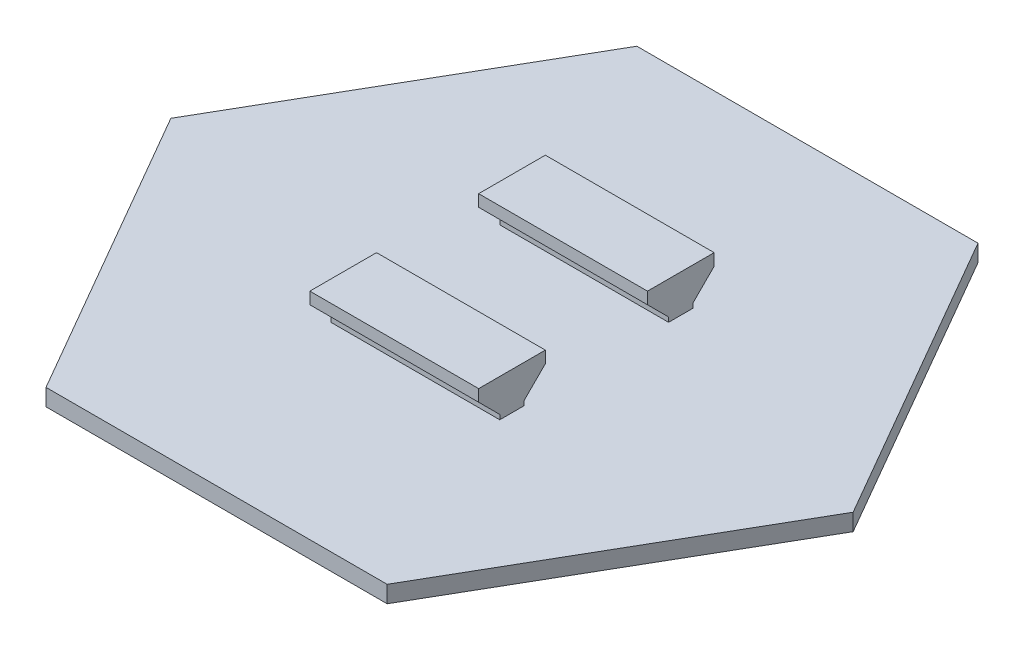
ISO-10303-21;
HEADER;
FILE_DESCRIPTION(('STEP AP214'),'2;1');
FILE_NAME('part.step','',(''),(''),'','','');
FILE_SCHEMA(('AUTOMOTIVE_DESIGN { 1 0 10303 214 1 1 1 1 }'));
ENDSEC;
DATA;
#1=APPLICATION_CONTEXT('core data for automotive mechanical design processes');
#2=APPLICATION_PROTOCOL_DEFINITION('international standard','automotive_design',2000,#1);
#3=PRODUCT_CONTEXT('',#1,'mechanical');
#4=PRODUCT('Part','Part','',(#3));
#5=PRODUCT_RELATED_PRODUCT_CATEGORY('part','',(#4));
#6=PRODUCT_DEFINITION_FORMATION('','',#4);
#7=PRODUCT_DEFINITION_CONTEXT('part definition',#1,'design');
#8=PRODUCT_DEFINITION('design','',#6,#7);
#9=PRODUCT_DEFINITION_SHAPE('','',#8);
#10=(LENGTH_UNIT() NAMED_UNIT(*) SI_UNIT(.MILLI.,.METRE.));
#11=(NAMED_UNIT(*) PLANE_ANGLE_UNIT() SI_UNIT($,.RADIAN.));
#12=(NAMED_UNIT(*) SI_UNIT($,.STERADIAN.) SOLID_ANGLE_UNIT());
#13=UNCERTAINTY_MEASURE_WITH_UNIT(LENGTH_MEASURE(1.E-05),#10,'distance_accuracy_value','');
#14=(GEOMETRIC_REPRESENTATION_CONTEXT(3) GLOBAL_UNCERTAINTY_ASSIGNED_CONTEXT((#13)) GLOBAL_UNIT_ASSIGNED_CONTEXT((#10,
#11,#12)) REPRESENTATION_CONTEXT('',''));
#15=CARTESIAN_POINT('',(0.,0.,0.));
#16=DIRECTION('',(0.,0.,1.));
#17=DIRECTION('',(1.,0.,0.));
#18=AXIS2_PLACEMENT_3D('',#15,#16,#17);
#19=CARTESIAN_POINT('',(0.,1.,0.));
#20=DIRECTION('',(0.,1.,0.));
#21=DIRECTION('',(0.,0.,1.));
#22=AXIS2_PLACEMENT_3D('',#19,#20,#21);
#23=PLANE('',#22);
#24=DIRECTION('',(0.5,0.,-0.866025403784439));
#25=VECTOR('',#24,1.);
#26=CARTESIAN_POINT('',(20.2072594216369,1.,35.));
#27=LINE('',#26,#25);
#28=CARTESIAN_POINT('',(20.2072594216369,1.,35.));
#29=VERTEX_POINT('',#28);
#30=CARTESIAN_POINT('',(40.4145188432738,1.,0.));
#31=VERTEX_POINT('',#30);
#32=EDGE_CURVE('E374',#29,#31,#27,.T.);
#33=ORIENTED_EDGE('',*,*,#32,.T.);
#34=DIRECTION('',(-0.5,0.,-0.866025403784439));
#35=VECTOR('',#34,1.);
#36=CARTESIAN_POINT('',(40.4145188432738,1.,0.));
#37=LINE('',#36,#35);
#38=CARTESIAN_POINT('',(20.2072594216369,1.,-35.));
#39=VERTEX_POINT('',#38);
#40=EDGE_CURVE('E378',#31,#39,#37,.T.);
#41=ORIENTED_EDGE('',*,*,#40,.T.);
#42=DIRECTION('',(-1.,0.,0.));
#43=VECTOR('',#42,1.);
#44=CARTESIAN_POINT('',(20.2072594216369,1.,-35.));
#45=LINE('',#44,#43);
#46=CARTESIAN_POINT('',(-20.2072594216369,1.,-35.));
#47=VERTEX_POINT('',#46);
#48=EDGE_CURVE('E382',#39,#47,#45,.T.);
#49=ORIENTED_EDGE('',*,*,#48,.T.);
#50=DIRECTION('',(-0.5,0.,0.866025403784439));
#51=VECTOR('',#50,1.);
#52=CARTESIAN_POINT('',(-20.2072594216369,1.,-35.));
#53=LINE('',#52,#51);
#54=CARTESIAN_POINT('',(-40.4145188432738,1.,0.));
#55=VERTEX_POINT('',#54);
#56=EDGE_CURVE('E385',#47,#55,#53,.T.);
#57=ORIENTED_EDGE('',*,*,#56,.T.);
#58=DIRECTION('',(0.5,0.,0.866025403784439));
#59=VECTOR('',#58,1.);
#60=CARTESIAN_POINT('',(-40.4145188432738,1.,0.));
#61=LINE('',#60,#59);
#62=CARTESIAN_POINT('',(-20.2072594216369,1.,35.));
#63=VERTEX_POINT('',#62);
#64=EDGE_CURVE('E388',#55,#63,#61,.T.);
#65=ORIENTED_EDGE('',*,*,#64,.T.);
#66=DIRECTION('',(1.,0.,0.));
#67=VECTOR('',#66,1.);
#68=CARTESIAN_POINT('',(-20.2072594216369,1.,35.));
#69=LINE('',#68,#67);
#70=EDGE_CURVE('E391',#63,#29,#69,.T.);
#71=ORIENTED_EDGE('',*,*,#70,.T.);
#72=EDGE_LOOP('',(#33,#41,#49,#57,#65,#71));
#73=FACE_BOUND('',#72,.T.);
#74=DIRECTION('',(1.,0.,0.));
#75=VECTOR('',#74,1.);
#76=CARTESIAN_POINT('',(-10.,1.,11.45));
#77=LINE('',#76,#75);
#78=CARTESIAN_POINT('',(-10.,1.,11.45));
#79=VERTEX_POINT('',#78);
#80=CARTESIAN_POINT('',(10.,1.,11.45));
#81=VERTEX_POINT('',#80);
#82=EDGE_CURVE('E355',#79,#81,#77,.T.);
#83=ORIENTED_EDGE('',*,*,#82,.F.);
#84=DIRECTION('',(0.,0.,-1.));
#85=VECTOR('',#84,1.);
#86=CARTESIAN_POINT('',(-10.,1.,0.));
#87=LINE('',#86,#85);
#88=CARTESIAN_POINT('',(-10.,1.,8.55));
#89=VERTEX_POINT('',#88);
#90=EDGE_CURVE('E307',#79,#89,#87,.T.);
#91=ORIENTED_EDGE('',*,*,#90,.T.);
#92=DIRECTION('',(1.,0.,0.));
#93=VECTOR('',#92,1.);
#94=CARTESIAN_POINT('',(-10.,1.,8.55));
#95=LINE('',#94,#93);
#96=CARTESIAN_POINT('',(10.,1.,8.55));
#97=VERTEX_POINT('',#96);
#98=EDGE_CURVE('E352',#89,#97,#95,.T.);
#99=ORIENTED_EDGE('',*,*,#98,.T.);
#100=DIRECTION('',(0.,0.,-1.));
#101=VECTOR('',#100,1.);
#102=CARTESIAN_POINT('',(10.,1.,0.));
#103=LINE('',#102,#101);
#104=EDGE_CURVE('E333',#81,#97,#103,.T.);
#105=ORIENTED_EDGE('',*,*,#104,.F.);
#106=EDGE_LOOP('',(#83,#91,#99,#105));
#107=FACE_BOUND('',#106,.T.);
#108=DIRECTION('',(1.,0.,0.));
#109=VECTOR('',#108,1.);
#110=CARTESIAN_POINT('',(-10.,1.,-8.55));
#111=LINE('',#110,#109);
#112=CARTESIAN_POINT('',(-10.,1.,-8.55));
#113=VERTEX_POINT('',#112);
#114=CARTESIAN_POINT('',(10.,1.,-8.55));
#115=VERTEX_POINT('',#114);
#116=EDGE_CURVE('E68',#113,#115,#111,.T.);
#117=ORIENTED_EDGE('',*,*,#116,.F.);
#118=DIRECTION('',(0.,0.,1.));
#119=VECTOR('',#118,1.);
#120=CARTESIAN_POINT('',(-10.,1.,0.));
#121=LINE('',#120,#119);
#122=CARTESIAN_POINT('',(-10.,1.,-11.45));
#123=VERTEX_POINT('',#122);
#124=EDGE_CURVE('E63',#123,#113,#121,.T.);
#125=ORIENTED_EDGE('',*,*,#124,.F.);
#126=DIRECTION('',(1.,0.,0.));
#127=VECTOR('',#126,1.);
#128=CARTESIAN_POINT('',(-10.,1.,-11.45));
#129=LINE('',#128,#127);
#130=CARTESIAN_POINT('',(10.,1.,-11.45));
#131=VERTEX_POINT('',#130);
#132=EDGE_CURVE('E283',#123,#131,#129,.T.);
#133=ORIENTED_EDGE('',*,*,#132,.T.);
#134=DIRECTION('',(0.,0.,1.));
#135=VECTOR('',#134,1.);
#136=CARTESIAN_POINT('',(10.,1.,0.));
#137=LINE('',#136,#135);
#138=EDGE_CURVE('E257',#131,#115,#137,.T.);
#139=ORIENTED_EDGE('',*,*,#138,.T.);
#140=EDGE_LOOP('',(#117,#125,#133,#139));
#141=FACE_BOUND('',#140,.T.);
#142=ADVANCED_FACE('F47',(#73,#107,#141),#23,.T.);
#143=CARTESIAN_POINT('',(20.2072594216369,1.,35.));
#144=DIRECTION('',(-0.866025403784439,0.,-0.5));
#145=DIRECTION('',(-0.5,0.,0.866025403784439));
#146=AXIS2_PLACEMENT_3D('',#143,#144,#145);
#147=PLANE('',#146);
#148=DIRECTION('',(0.5,0.,-0.866025403784439));
#149=VECTOR('',#148,1.);
#150=CARTESIAN_POINT('',(20.2072594216369,-1.,35.));
#151=LINE('',#150,#149);
#152=CARTESIAN_POINT('',(20.2072594216369,-1.,35.));
#153=VERTEX_POINT('',#152);
#154=CARTESIAN_POINT('',(40.4145188432738,-1.,0.));
#155=VERTEX_POINT('',#154);
#156=EDGE_CURVE('E348',#153,#155,#151,.T.);
#157=ORIENTED_EDGE('',*,*,#156,.T.);
#158=DIRECTION('',(0.,-1.,0.));
#159=VECTOR('',#158,1.);
#160=CARTESIAN_POINT('',(40.4145188432738,1.,0.));
#161=LINE('',#160,#159);
#162=EDGE_CURVE('E11',#31,#155,#161,.T.);
#163=ORIENTED_EDGE('',*,*,#162,.F.);
#164=ORIENTED_EDGE('',*,*,#32,.F.);
#165=DIRECTION('',(0.,-1.,0.));
#166=VECTOR('',#165,1.);
#167=CARTESIAN_POINT('',(20.2072594216369,1.,35.));
#168=LINE('',#167,#166);
#169=EDGE_CURVE('E394',#29,#153,#168,.T.);
#170=ORIENTED_EDGE('',*,*,#169,.T.);
#171=EDGE_LOOP('',(#157,#163,#164,#170));
#172=FACE_BOUND('',#171,.T.);
#173=ADVANCED_FACE('F49',(#172),#147,.F.);
#174=CARTESIAN_POINT('',(40.4145188432738,1.,0.));
#175=DIRECTION('',(-0.866025403784439,0.,0.5));
#176=DIRECTION('',(0.5,0.,0.866025403784439));
#177=AXIS2_PLACEMENT_3D('',#174,#175,#176);
#178=PLANE('',#177);
#179=DIRECTION('',(-0.5,0.,-0.866025403784439));
#180=VECTOR('',#179,1.);
#181=CARTESIAN_POINT('',(40.4145188432738,-1.,0.));
#182=LINE('',#181,#180);
#183=CARTESIAN_POINT('',(20.2072594216369,-1.,-35.));
#184=VERTEX_POINT('',#183);
#185=EDGE_CURVE('E398',#155,#184,#182,.T.);
#186=ORIENTED_EDGE('',*,*,#185,.T.);
#187=DIRECTION('',(0.,-1.,0.));
#188=VECTOR('',#187,1.);
#189=CARTESIAN_POINT('',(20.2072594216369,1.,-35.));
#190=LINE('',#189,#188);
#191=EDGE_CURVE('E56',#39,#184,#190,.T.);
#192=ORIENTED_EDGE('',*,*,#191,.F.);
#193=ORIENTED_EDGE('',*,*,#40,.F.);
#194=ORIENTED_EDGE('',*,*,#162,.T.);
#195=EDGE_LOOP('',(#186,#192,#193,#194));
#196=FACE_BOUND('',#195,.T.);
#197=ADVANCED_FACE('F455',(#196),#178,.F.);
#198=CARTESIAN_POINT('',(20.2072594216369,1.,-35.));
#199=DIRECTION('',(0.,0.,1.));
#200=DIRECTION('',(1.,0.,0.));
#201=AXIS2_PLACEMENT_3D('',#198,#199,#200);
#202=PLANE('',#201);
#203=DIRECTION('',(-1.,0.,0.));
#204=VECTOR('',#203,1.);
#205=CARTESIAN_POINT('',(20.2072594216369,-1.,-35.));
#206=LINE('',#205,#204);
#207=CARTESIAN_POINT('',(-20.2072594216369,-1.,-35.));
#208=VERTEX_POINT('',#207);
#209=EDGE_CURVE('E401',#184,#208,#206,.T.);
#210=ORIENTED_EDGE('',*,*,#209,.T.);
#211=DIRECTION('',(0.,-1.,0.));
#212=VECTOR('',#211,1.);
#213=CARTESIAN_POINT('',(-20.2072594216369,1.,-35.));
#214=LINE('',#213,#212);
#215=EDGE_CURVE('E423',#47,#208,#214,.T.);
#216=ORIENTED_EDGE('',*,*,#215,.F.);
#217=ORIENTED_EDGE('',*,*,#48,.F.);
#218=ORIENTED_EDGE('',*,*,#191,.T.);
#219=EDGE_LOOP('',(#210,#216,#217,#218));
#220=FACE_BOUND('',#219,.T.);
#221=ADVANCED_FACE('F432',(#220),#202,.F.);
#222=CARTESIAN_POINT('',(-20.2072594216369,1.,-35.));
#223=DIRECTION('',(0.866025403784439,0.,0.5));
#224=DIRECTION('',(0.5,0.,-0.866025403784439));
#225=AXIS2_PLACEMENT_3D('',#222,#223,#224);
#226=PLANE('',#225);
#227=DIRECTION('',(-0.5,0.,0.866025403784439));
#228=VECTOR('',#227,1.);
#229=CARTESIAN_POINT('',(-20.2072594216369,-1.,-35.));
#230=LINE('',#229,#228);
#231=CARTESIAN_POINT('',(-40.4145188432738,-1.,0.));
#232=VERTEX_POINT('',#231);
#233=EDGE_CURVE('E404',#208,#232,#230,.T.);
#234=ORIENTED_EDGE('',*,*,#233,.T.);
#235=DIRECTION('',(0.,-1.,0.));
#236=VECTOR('',#235,1.);
#237=CARTESIAN_POINT('',(-40.4145188432738,1.,0.));
#238=LINE('',#237,#236);
#239=EDGE_CURVE('E419',#55,#232,#238,.T.);
#240=ORIENTED_EDGE('',*,*,#239,.F.);
#241=ORIENTED_EDGE('',*,*,#56,.F.);
#242=ORIENTED_EDGE('',*,*,#215,.T.);
#243=EDGE_LOOP('',(#234,#240,#241,#242));
#244=FACE_BOUND('',#243,.T.);
#245=ADVANCED_FACE('F443',(#244),#226,.F.);
#246=CARTESIAN_POINT('',(-40.4145188432738,1.,0.));
#247=DIRECTION('',(0.866025403784439,0.,-0.5));
#248=DIRECTION('',(-0.5,0.,-0.866025403784439));
#249=AXIS2_PLACEMENT_3D('',#246,#247,#248);
#250=PLANE('',#249);
#251=DIRECTION('',(0.5,0.,0.866025403784439));
#252=VECTOR('',#251,1.);
#253=CARTESIAN_POINT('',(-40.4145188432738,-1.,0.));
#254=LINE('',#253,#252);
#255=CARTESIAN_POINT('',(-20.2072594216369,-1.,35.));
#256=VERTEX_POINT('',#255);
#257=EDGE_CURVE('E407',#232,#256,#254,.T.);
#258=ORIENTED_EDGE('',*,*,#257,.T.);
#259=DIRECTION('',(0.,-1.,0.));
#260=VECTOR('',#259,1.);
#261=CARTESIAN_POINT('',(-20.2072594216369,1.,35.));
#262=LINE('',#261,#260);
#263=EDGE_CURVE('E415',#63,#256,#262,.T.);
#264=ORIENTED_EDGE('',*,*,#263,.F.);
#265=ORIENTED_EDGE('',*,*,#64,.F.);
#266=ORIENTED_EDGE('',*,*,#239,.T.);
#267=EDGE_LOOP('',(#258,#264,#265,#266));
#268=FACE_BOUND('',#267,.T.);
#269=ADVANCED_FACE('F447',(#268),#250,.F.);
#270=CARTESIAN_POINT('',(-20.2072594216369,1.,35.));
#271=DIRECTION('',(0.,0.,-1.));
#272=DIRECTION('',(-1.,0.,0.));
#273=AXIS2_PLACEMENT_3D('',#270,#271,#272);
#274=PLANE('',#273);
#275=DIRECTION('',(1.,0.,0.));
#276=VECTOR('',#275,1.);
#277=CARTESIAN_POINT('',(-20.2072594216369,-1.,35.));
#278=LINE('',#277,#276);
#279=EDGE_CURVE('E379',#256,#153,#278,.T.);
#280=ORIENTED_EDGE('',*,*,#279,.T.);
#281=ORIENTED_EDGE('',*,*,#169,.F.);
#282=ORIENTED_EDGE('',*,*,#70,.F.);
#283=ORIENTED_EDGE('',*,*,#263,.T.);
#284=EDGE_LOOP('',(#280,#281,#282,#283));
#285=FACE_BOUND('',#284,.T.);
#286=ADVANCED_FACE('F458',(#285),#274,.F.);
#287=CARTESIAN_POINT('',(0.,-1.,0.));
#288=DIRECTION('',(0.,1.,0.));
#289=DIRECTION('',(0.,0.,1.));
#290=AXIS2_PLACEMENT_3D('',#287,#288,#289);
#291=PLANE('',#290);
#292=ORIENTED_EDGE('',*,*,#156,.F.);
#293=ORIENTED_EDGE('',*,*,#279,.F.);
#294=ORIENTED_EDGE('',*,*,#257,.F.);
#295=ORIENTED_EDGE('',*,*,#233,.F.);
#296=ORIENTED_EDGE('',*,*,#209,.F.);
#297=ORIENTED_EDGE('',*,*,#185,.F.);
#298=EDGE_LOOP('',(#292,#293,#294,#295,#296,#297));
#299=FACE_BOUND('',#298,.T.);
#300=ADVANCED_FACE('F438',(#299),#291,.F.);
#301=CARTESIAN_POINT('',(-10.,0.,6.05000000000001));
#302=DIRECTION('',(0.,0.,1.));
#303=DIRECTION('',(0.,-1.,0.));
#304=AXIS2_PLACEMENT_3D('',#301,#302,#303);
#305=PLANE('',#304);
#306=DIRECTION('',(0.,-1.,0.));
#307=VECTOR('',#306,1.);
#308=CARTESIAN_POINT('',(10.,0.,6.05000000000001));
#309=LINE('',#308,#307);
#310=CARTESIAN_POINT('',(10.,5.45,6.05));
#311=VERTEX_POINT('',#310);
#312=CARTESIAN_POINT('',(10.,4.05,6.05));
#313=VERTEX_POINT('',#312);
#314=EDGE_CURVE('E273',#311,#313,#309,.T.);
#315=ORIENTED_EDGE('',*,*,#314,.T.);
#316=DIRECTION('',(1.,0.,0.));
#317=VECTOR('',#316,1.);
#318=CARTESIAN_POINT('',(-10.,4.05,6.05));
#319=LINE('',#318,#317);
#320=CARTESIAN_POINT('',(-10.,4.05,6.05));
#321=VERTEX_POINT('',#320);
#322=EDGE_CURVE('E344',#321,#313,#319,.T.);
#323=ORIENTED_EDGE('',*,*,#322,.F.);
#324=DIRECTION('',(0.,-1.,0.));
#325=VECTOR('',#324,1.);
#326=CARTESIAN_POINT('',(-10.,0.,6.05000000000001));
#327=LINE('',#326,#325);
#328=CARTESIAN_POINT('',(-10.,5.45,6.05));
#329=VERTEX_POINT('',#328);
#330=EDGE_CURVE('E290',#329,#321,#327,.T.);
#331=ORIENTED_EDGE('',*,*,#330,.F.);
#332=DIRECTION('',(1.,0.,0.));
#333=VECTOR('',#332,1.);
#334=CARTESIAN_POINT('',(-10.,5.45,6.05));
#335=LINE('',#334,#333);
#336=EDGE_CURVE('E317',#329,#311,#335,.T.);
#337=ORIENTED_EDGE('',*,*,#336,.T.);
#338=EDGE_LOOP('',(#315,#323,#331,#337));
#339=FACE_BOUND('',#338,.T.);
#340=ADVANCED_FACE('F465',(#339),#305,.F.);
#341=CARTESIAN_POINT('',(-10.,5.05,5.05));
#342=DIRECTION('',(0.,0.707106781186548,0.707106781186547));
#343=DIRECTION('',(0.,-0.707106781186547,0.707106781186548));
#344=AXIS2_PLACEMENT_3D('',#341,#342,#343);
#345=PLANE('',#344);
#346=DIRECTION('',(0.,-0.707106781186547,0.707106781186548));
#347=VECTOR('',#346,1.);
#348=CARTESIAN_POINT('',(10.,5.05,5.05));
#349=LINE('',#348,#347);
#350=CARTESIAN_POINT('',(10.,1.55,8.55));
#351=VERTEX_POINT('',#350);
#352=EDGE_CURVE('E295',#313,#351,#349,.T.);
#353=ORIENTED_EDGE('',*,*,#352,.T.);
#354=DIRECTION('',(1.,0.,0.));
#355=VECTOR('',#354,1.);
#356=CARTESIAN_POINT('',(-10.,1.55,8.55));
#357=LINE('',#356,#355);
#358=CARTESIAN_POINT('',(-10.,1.55,8.55));
#359=VERTEX_POINT('',#358);
#360=EDGE_CURVE('E349',#359,#351,#357,.T.);
#361=ORIENTED_EDGE('',*,*,#360,.F.);
#362=DIRECTION('',(0.,-0.707106781186547,0.707106781186548));
#363=VECTOR('',#362,1.);
#364=CARTESIAN_POINT('',(-10.,5.05,5.05));
#365=LINE('',#364,#363);
#366=EDGE_CURVE('E314',#321,#359,#365,.T.);
#367=ORIENTED_EDGE('',*,*,#366,.F.);
#368=ORIENTED_EDGE('',*,*,#322,.T.);
#369=EDGE_LOOP('',(#353,#361,#367,#368));
#370=FACE_BOUND('',#369,.T.);
#371=ADVANCED_FACE('F476',(#370),#345,.F.);
#372=CARTESIAN_POINT('',(-10.,0.,8.55));
#373=DIRECTION('',(0.,0.,-1.));
#374=DIRECTION('',(-1.,0.,0.));
#375=AXIS2_PLACEMENT_3D('',#372,#373,#374);
#376=PLANE('',#375);
#377=DIRECTION('',(0.,1.,0.));
#378=VECTOR('',#377,1.);
#379=CARTESIAN_POINT('',(10.,0.,8.55));
#380=LINE('',#379,#378);
#381=EDGE_CURVE('E337',#97,#351,#380,.T.);
#382=ORIENTED_EDGE('',*,*,#381,.F.);
#383=ORIENTED_EDGE('',*,*,#98,.F.);
#384=DIRECTION('',(0.,1.,0.));
#385=VECTOR('',#384,1.);
#386=CARTESIAN_POINT('',(-10.,0.,8.55));
#387=LINE('',#386,#385);
#388=EDGE_CURVE('E310',#89,#359,#387,.T.);
#389=ORIENTED_EDGE('',*,*,#388,.T.);
#390=ORIENTED_EDGE('',*,*,#360,.T.);
#391=EDGE_LOOP('',(#382,#383,#389,#390));
#392=FACE_BOUND('',#391,.T.);
#393=ADVANCED_FACE('F494',(#392),#376,.T.);
#394=CARTESIAN_POINT('',(-10.,0.,11.45));
#395=DIRECTION('',(0.,0.,-1.));
#396=DIRECTION('',(-1.,0.,0.));
#397=AXIS2_PLACEMENT_3D('',#394,#395,#396);
#398=PLANE('',#397);
#399=DIRECTION('',(0.,1.,0.));
#400=VECTOR('',#399,1.);
#401=CARTESIAN_POINT('',(10.,0.,11.45));
#402=LINE('',#401,#400);
#403=CARTESIAN_POINT('',(10.,1.55,11.45));
#404=VERTEX_POINT('',#403);
#405=EDGE_CURVE('E330',#81,#404,#402,.T.);
#406=ORIENTED_EDGE('',*,*,#405,.T.);
#407=DIRECTION('',(1.,0.,0.));
#408=VECTOR('',#407,1.);
#409=CARTESIAN_POINT('',(-10.,1.55,11.45));
#410=LINE('',#409,#408);
#411=CARTESIAN_POINT('',(-10.,1.55,11.45));
#412=VERTEX_POINT('',#411);
#413=EDGE_CURVE('E359',#412,#404,#410,.T.);
#414=ORIENTED_EDGE('',*,*,#413,.F.);
#415=DIRECTION('',(0.,1.,0.));
#416=VECTOR('',#415,1.);
#417=CARTESIAN_POINT('',(-10.,0.,11.45));
#418=LINE('',#417,#416);
#419=EDGE_CURVE('E304',#79,#412,#418,.T.);
#420=ORIENTED_EDGE('',*,*,#419,.F.);
#421=ORIENTED_EDGE('',*,*,#82,.T.);
#422=EDGE_LOOP('',(#406,#414,#420,#421));
#423=FACE_BOUND('',#422,.T.);
#424=ADVANCED_FACE('F490',(#423),#398,.F.);
#425=CARTESIAN_POINT('',(-10.,-4.95,4.95));
#426=DIRECTION('',(0.,0.707106781186548,-0.707106781186547));
#427=DIRECTION('',(0.,0.707106781186547,0.707106781186548));
#428=AXIS2_PLACEMENT_3D('',#425,#426,#427);
#429=PLANE('',#428);
#430=DIRECTION('',(0.,0.707106781186547,0.707106781186548));
#431=VECTOR('',#430,1.);
#432=CARTESIAN_POINT('',(10.,-4.95,4.95));
#433=LINE('',#432,#431);
#434=CARTESIAN_POINT('',(10.,4.05,13.95));
#435=VERTEX_POINT('',#434);
#436=EDGE_CURVE('E327',#404,#435,#433,.T.);
#437=ORIENTED_EDGE('',*,*,#436,.T.);
#438=DIRECTION('',(1.,0.,0.));
#439=VECTOR('',#438,1.);
#440=CARTESIAN_POINT('',(-10.,4.05,13.95));
#441=LINE('',#440,#439);
#442=CARTESIAN_POINT('',(-10.,4.05,13.95));
#443=VERTEX_POINT('',#442);
#444=EDGE_CURVE('E363',#443,#435,#441,.T.);
#445=ORIENTED_EDGE('',*,*,#444,.F.);
#446=DIRECTION('',(0.,0.707106781186547,0.707106781186548));
#447=VECTOR('',#446,1.);
#448=CARTESIAN_POINT('',(-10.,-4.95,4.95));
#449=LINE('',#448,#447);
#450=EDGE_CURVE('E301',#412,#443,#449,.T.);
#451=ORIENTED_EDGE('',*,*,#450,.F.);
#452=ORIENTED_EDGE('',*,*,#413,.T.);
#453=EDGE_LOOP('',(#437,#445,#451,#452));
#454=FACE_BOUND('',#453,.T.);
#455=ADVANCED_FACE('F486',(#454),#429,.F.);
#456=CARTESIAN_POINT('',(-10.,0.,13.95));
#457=DIRECTION('',(0.,0.,-1.));
#458=DIRECTION('',(0.,1.,0.));
#459=AXIS2_PLACEMENT_3D('',#456,#457,#458);
#460=PLANE('',#459);
#461=DIRECTION('',(0.,1.,0.));
#462=VECTOR('',#461,1.);
#463=CARTESIAN_POINT('',(10.,0.,13.95));
#464=LINE('',#463,#462);
#465=CARTESIAN_POINT('',(10.,5.45,13.95));
#466=VERTEX_POINT('',#465);
#467=EDGE_CURVE('E324',#435,#466,#464,.T.);
#468=ORIENTED_EDGE('',*,*,#467,.T.);
#469=DIRECTION('',(1.,0.,0.));
#470=VECTOR('',#469,1.);
#471=CARTESIAN_POINT('',(-10.,5.45,13.95));
#472=LINE('',#471,#470);
#473=CARTESIAN_POINT('',(-10.,5.45,13.95));
#474=VERTEX_POINT('',#473);
#475=EDGE_CURVE('E367',#474,#466,#472,.T.);
#476=ORIENTED_EDGE('',*,*,#475,.F.);
#477=DIRECTION('',(0.,1.,0.));
#478=VECTOR('',#477,1.);
#479=CARTESIAN_POINT('',(-10.,0.,13.95));
#480=LINE('',#479,#478);
#481=EDGE_CURVE('E298',#443,#474,#480,.T.);
#482=ORIENTED_EDGE('',*,*,#481,.F.);
#483=ORIENTED_EDGE('',*,*,#444,.T.);
#484=EDGE_LOOP('',(#468,#476,#482,#483));
#485=FACE_BOUND('',#484,.T.);
#486=ADVANCED_FACE('F482',(#485),#460,.F.);
#487=CARTESIAN_POINT('',(-10.,5.45,0.));
#488=DIRECTION('',(0.,-1.,0.));
#489=DIRECTION('',(0.,0.,-1.));
#490=AXIS2_PLACEMENT_3D('',#487,#488,#489);
#491=PLANE('',#490);
#492=DIRECTION('',(0.,0.,-1.));
#493=VECTOR('',#492,1.);
#494=CARTESIAN_POINT('',(10.,5.45,0.));
#495=LINE('',#494,#493);
#496=EDGE_CURVE('E321',#466,#311,#495,.T.);
#497=ORIENTED_EDGE('',*,*,#496,.T.);
#498=ORIENTED_EDGE('',*,*,#336,.F.);
#499=DIRECTION('',(0.,0.,-1.));
#500=VECTOR('',#499,1.);
#501=CARTESIAN_POINT('',(-10.,5.45,0.));
#502=LINE('',#501,#500);
#503=EDGE_CURVE('E294',#474,#329,#502,.T.);
#504=ORIENTED_EDGE('',*,*,#503,.F.);
#505=ORIENTED_EDGE('',*,*,#475,.T.);
#506=EDGE_LOOP('',(#497,#498,#504,#505));
#507=FACE_BOUND('',#506,.T.);
#508=ADVANCED_FACE('F478',(#507),#491,.F.);
#509=CARTESIAN_POINT('',(-10.,0.,0.));
#510=DIRECTION('',(1.,0.,0.));
#511=DIRECTION('',(0.,0.,-1.));
#512=AXIS2_PLACEMENT_3D('',#509,#510,#511);
#513=PLANE('',#512);
#514=ORIENTED_EDGE('',*,*,#330,.T.);
#515=ORIENTED_EDGE('',*,*,#366,.T.);
#516=ORIENTED_EDGE('',*,*,#388,.F.);
#517=ORIENTED_EDGE('',*,*,#90,.F.);
#518=ORIENTED_EDGE('',*,*,#419,.T.);
#519=ORIENTED_EDGE('',*,*,#450,.T.);
#520=ORIENTED_EDGE('',*,*,#481,.T.);
#521=ORIENTED_EDGE('',*,*,#503,.T.);
#522=EDGE_LOOP('',(#514,#515,#516,#517,#518,#519,#520,#521));
#523=FACE_BOUND('',#522,.T.);
#524=ADVANCED_FACE('F481',(#523),#513,.F.);
#525=CARTESIAN_POINT('',(10.,0.,0.));
#526=DIRECTION('',(1.,0.,0.));
#527=DIRECTION('',(0.,0.,-1.));
#528=AXIS2_PLACEMENT_3D('',#525,#526,#527);
#529=PLANE('',#528);
#530=ORIENTED_EDGE('',*,*,#314,.F.);
#531=ORIENTED_EDGE('',*,*,#496,.F.);
#532=ORIENTED_EDGE('',*,*,#467,.F.);
#533=ORIENTED_EDGE('',*,*,#436,.F.);
#534=ORIENTED_EDGE('',*,*,#405,.F.);
#535=ORIENTED_EDGE('',*,*,#104,.T.);
#536=ORIENTED_EDGE('',*,*,#381,.T.);
#537=ORIENTED_EDGE('',*,*,#352,.F.);
#538=EDGE_LOOP('',(#530,#531,#532,#533,#534,#535,#536,#537));
#539=FACE_BOUND('',#538,.T.);
#540=ADVANCED_FACE('F502',(#539),#529,.T.);
#541=CARTESIAN_POINT('',(-10.,0.,-6.05000000000001));
#542=DIRECTION('',(0.,0.,1.));
#543=DIRECTION('',(0.,-1.,0.));
#544=AXIS2_PLACEMENT_3D('',#541,#542,#543);
#545=PLANE('',#544);
#546=DIRECTION('',(0.,-1.,0.));
#547=VECTOR('',#546,1.);
#548=CARTESIAN_POINT('',(10.,0.,-6.05000000000001));
#549=LINE('',#548,#547);
#550=CARTESIAN_POINT('',(10.,5.45,-6.05));
#551=VERTEX_POINT('',#550);
#552=CARTESIAN_POINT('',(10.,4.05,-6.05));
#553=VERTEX_POINT('',#552);
#554=EDGE_CURVE('E248',#551,#553,#549,.T.);
#555=ORIENTED_EDGE('',*,*,#554,.F.);
#556=DIRECTION('',(1.,0.,0.));
#557=VECTOR('',#556,1.);
#558=CARTESIAN_POINT('',(-10.,5.45,-6.05));
#559=LINE('',#558,#557);
#560=CARTESIAN_POINT('',(-10.,5.45,-6.05));
#561=VERTEX_POINT('',#560);
#562=EDGE_CURVE('E221',#561,#551,#559,.T.);
#563=ORIENTED_EDGE('',*,*,#562,.F.);
#564=DIRECTION('',(0.,-1.,0.));
#565=VECTOR('',#564,1.);
#566=CARTESIAN_POINT('',(-10.,0.,-6.05000000000001));
#567=LINE('',#566,#565);
#568=CARTESIAN_POINT('',(-10.,4.05,-6.05));
#569=VERTEX_POINT('',#568);
#570=EDGE_CURVE('E213',#561,#569,#567,.T.);
#571=ORIENTED_EDGE('',*,*,#570,.T.);
#572=DIRECTION('',(1.,0.,0.));
#573=VECTOR('',#572,1.);
#574=CARTESIAN_POINT('',(-10.,4.05,-6.05));
#575=LINE('',#574,#573);
#576=EDGE_CURVE('E195',#569,#553,#575,.T.);
#577=ORIENTED_EDGE('',*,*,#576,.T.);
#578=EDGE_LOOP('',(#555,#563,#571,#577));
#579=FACE_BOUND('',#578,.T.);
#580=ADVANCED_FACE('F220',(#579),#545,.T.);
#581=CARTESIAN_POINT('',(-10.,5.45,0.));
#582=DIRECTION('',(0.,1.,0.));
#583=DIRECTION('',(0.,0.,1.));
#584=AXIS2_PLACEMENT_3D('',#581,#582,#583);
#585=PLANE('',#584);
#586=DIRECTION('',(0.,0.,1.));
#587=VECTOR('',#586,1.);
#588=CARTESIAN_POINT('',(10.,5.45,0.));
#589=LINE('',#588,#587);
#590=CARTESIAN_POINT('',(10.,5.45,-13.95));
#591=VERTEX_POINT('',#590);
#592=EDGE_CURVE('E223',#591,#551,#589,.T.);
#593=ORIENTED_EDGE('',*,*,#592,.F.);
#594=DIRECTION('',(1.,0.,0.));
#595=VECTOR('',#594,1.);
#596=CARTESIAN_POINT('',(-10.,5.45,-13.95));
#597=LINE('',#596,#595);
#598=CARTESIAN_POINT('',(-10.,5.45,-13.95));
#599=VERTEX_POINT('',#598);
#600=EDGE_CURVE('E274',#599,#591,#597,.T.);
#601=ORIENTED_EDGE('',*,*,#600,.F.);
#602=DIRECTION('',(0.,0.,1.));
#603=VECTOR('',#602,1.);
#604=CARTESIAN_POINT('',(-10.,5.45,0.));
#605=LINE('',#604,#603);
#606=EDGE_CURVE('E207',#599,#561,#605,.T.);
#607=ORIENTED_EDGE('',*,*,#606,.T.);
#608=ORIENTED_EDGE('',*,*,#562,.T.);
#609=EDGE_LOOP('',(#593,#601,#607,#608));
#610=FACE_BOUND('',#609,.T.);
#611=ADVANCED_FACE('F511',(#610),#585,.T.);
#612=CARTESIAN_POINT('',(-10.,0.,-13.95));
#613=DIRECTION('',(0.,0.,-1.));
#614=DIRECTION('',(0.,1.,0.));
#615=AXIS2_PLACEMENT_3D('',#612,#613,#614);
#616=PLANE('',#615);
#617=DIRECTION('',(0.,1.,0.));
#618=VECTOR('',#617,1.);
#619=CARTESIAN_POINT('',(10.,0.,-13.95));
#620=LINE('',#619,#618);
#621=CARTESIAN_POINT('',(10.,4.05,-13.95));
#622=VERTEX_POINT('',#621);
#623=EDGE_CURVE('E227',#622,#591,#620,.T.);
#624=ORIENTED_EDGE('',*,*,#623,.F.);
#625=DIRECTION('',(1.,0.,0.));
#626=VECTOR('',#625,1.);
#627=CARTESIAN_POINT('',(-10.,4.05,-13.95));
#628=LINE('',#627,#626);
#629=CARTESIAN_POINT('',(-10.,4.05,-13.95));
#630=VERTEX_POINT('',#629);
#631=EDGE_CURVE('E277',#630,#622,#628,.T.);
#632=ORIENTED_EDGE('',*,*,#631,.F.);
#633=DIRECTION('',(0.,1.,0.));
#634=VECTOR('',#633,1.);
#635=CARTESIAN_POINT('',(-10.,0.,-13.95));
#636=LINE('',#635,#634);
#637=EDGE_CURVE('E242',#630,#599,#636,.T.);
#638=ORIENTED_EDGE('',*,*,#637,.T.);
#639=ORIENTED_EDGE('',*,*,#600,.T.);
#640=EDGE_LOOP('',(#624,#632,#638,#639));
#641=FACE_BOUND('',#640,.T.);
#642=ADVANCED_FACE('F525',(#641),#616,.T.);
#643=CARTESIAN_POINT('',(-10.,-4.95,-4.95));
#644=DIRECTION('',(0.,-0.707106781186548,-0.707106781186547));
#645=DIRECTION('',(0.,0.707106781186547,-0.707106781186548));
#646=AXIS2_PLACEMENT_3D('',#643,#644,#645);
#647=PLANE('',#646);
#648=DIRECTION('',(0.,0.707106781186547,-0.707106781186548));
#649=VECTOR('',#648,1.);
#650=CARTESIAN_POINT('',(10.,-4.95,-4.95));
#651=LINE('',#650,#649);
#652=CARTESIAN_POINT('',(10.,1.55,-11.45));
#653=VERTEX_POINT('',#652);
#654=EDGE_CURVE('E264',#653,#622,#651,.T.);
#655=ORIENTED_EDGE('',*,*,#654,.F.);
#656=DIRECTION('',(1.,0.,0.));
#657=VECTOR('',#656,1.);
#658=CARTESIAN_POINT('',(-10.,1.55,-11.45));
#659=LINE('',#658,#657);
#660=CARTESIAN_POINT('',(-10.,1.55,-11.45));
#661=VERTEX_POINT('',#660);
#662=EDGE_CURVE('E280',#661,#653,#659,.T.);
#663=ORIENTED_EDGE('',*,*,#662,.F.);
#664=DIRECTION('',(0.,0.707106781186547,-0.707106781186548));
#665=VECTOR('',#664,1.);
#666=CARTESIAN_POINT('',(-10.,-4.95,-4.95));
#667=LINE('',#666,#665);
#668=EDGE_CURVE('E238',#661,#630,#667,.T.);
#669=ORIENTED_EDGE('',*,*,#668,.T.);
#670=ORIENTED_EDGE('',*,*,#631,.T.);
#671=EDGE_LOOP('',(#655,#663,#669,#670));
#672=FACE_BOUND('',#671,.T.);
#673=ADVANCED_FACE('F521',(#672),#647,.T.);
#674=CARTESIAN_POINT('',(-10.,0.,-11.45));
#675=DIRECTION('',(0.,0.,-1.));
#676=DIRECTION('',(-1.,0.,0.));
#677=AXIS2_PLACEMENT_3D('',#674,#675,#676);
#678=PLANE('',#677);
#679=DIRECTION('',(0.,1.,0.));
#680=VECTOR('',#679,1.);
#681=CARTESIAN_POINT('',(10.,0.,-11.45));
#682=LINE('',#681,#680);
#683=EDGE_CURVE('E260',#131,#653,#682,.T.);
#684=ORIENTED_EDGE('',*,*,#683,.F.);
#685=ORIENTED_EDGE('',*,*,#132,.F.);
#686=DIRECTION('',(0.,1.,0.));
#687=VECTOR('',#686,1.);
#688=CARTESIAN_POINT('',(-10.,0.,-11.45));
#689=LINE('',#688,#687);
#690=EDGE_CURVE('E234',#123,#661,#689,.T.);
#691=ORIENTED_EDGE('',*,*,#690,.T.);
#692=ORIENTED_EDGE('',*,*,#662,.T.);
#693=EDGE_LOOP('',(#684,#685,#691,#692));
#694=FACE_BOUND('',#693,.T.);
#695=ADVANCED_FACE('F517',(#694),#678,.T.);
#696=CARTESIAN_POINT('',(-10.,0.,-8.55));
#697=DIRECTION('',(0.,0.,-1.));
#698=DIRECTION('',(-1.,0.,0.));
#699=AXIS2_PLACEMENT_3D('',#696,#697,#698);
#700=PLANE('',#699);
#701=DIRECTION('',(0.,1.,0.));
#702=VECTOR('',#701,1.);
#703=CARTESIAN_POINT('',(10.,0.,-8.55));
#704=LINE('',#703,#702);
#705=CARTESIAN_POINT('',(10.,1.55,-8.55));
#706=VERTEX_POINT('',#705);
#707=EDGE_CURVE('E253',#115,#706,#704,.T.);
#708=ORIENTED_EDGE('',*,*,#707,.T.);
#709=DIRECTION('',(1.,0.,0.));
#710=VECTOR('',#709,1.);
#711=CARTESIAN_POINT('',(-10.,1.55,-8.55));
#712=LINE('',#711,#710);
#713=CARTESIAN_POINT('',(-10.,1.55,-8.55));
#714=VERTEX_POINT('',#713);
#715=EDGE_CURVE('E206',#714,#706,#712,.T.);
#716=ORIENTED_EDGE('',*,*,#715,.F.);
#717=DIRECTION('',(0.,1.,0.));
#718=VECTOR('',#717,1.);
#719=CARTESIAN_POINT('',(-10.,0.,-8.55));
#720=LINE('',#719,#718);
#721=EDGE_CURVE('E216',#113,#714,#720,.T.);
#722=ORIENTED_EDGE('',*,*,#721,.F.);
#723=ORIENTED_EDGE('',*,*,#116,.T.);
#724=EDGE_LOOP('',(#708,#716,#722,#723));
#725=FACE_BOUND('',#724,.T.);
#726=ADVANCED_FACE('F514',(#725),#700,.F.);
#727=CARTESIAN_POINT('',(-10.,5.05,-5.05));
#728=DIRECTION('',(0.,-0.707106781186548,0.707106781186547));
#729=DIRECTION('',(0.,-0.707106781186547,-0.707106781186548));
#730=AXIS2_PLACEMENT_3D('',#727,#728,#729);
#731=PLANE('',#730);
#732=DIRECTION('',(0.,-0.707106781186547,-0.707106781186548));
#733=VECTOR('',#732,1.);
#734=CARTESIAN_POINT('',(10.,5.05,-5.05));
#735=LINE('',#734,#733);
#736=EDGE_CURVE('E200',#553,#706,#735,.T.);
#737=ORIENTED_EDGE('',*,*,#736,.F.);
#738=ORIENTED_EDGE('',*,*,#576,.F.);
#739=DIRECTION('',(0.,-0.707106781186547,-0.707106781186548));
#740=VECTOR('',#739,1.);
#741=CARTESIAN_POINT('',(-10.,5.05,-5.05));
#742=LINE('',#741,#740);
#743=EDGE_CURVE('E198',#569,#714,#742,.T.);
#744=ORIENTED_EDGE('',*,*,#743,.T.);
#745=ORIENTED_EDGE('',*,*,#715,.T.);
#746=EDGE_LOOP('',(#737,#738,#744,#745));
#747=FACE_BOUND('',#746,.T.);
#748=ADVANCED_FACE('F197',(#747),#731,.T.);
#749=CARTESIAN_POINT('',(-10.,0.,0.));
#750=DIRECTION('',(1.,0.,0.));
#751=DIRECTION('',(0.,0.,-1.));
#752=AXIS2_PLACEMENT_3D('',#749,#750,#751);
#753=PLANE('',#752);
#754=ORIENTED_EDGE('',*,*,#570,.F.);
#755=ORIENTED_EDGE('',*,*,#606,.F.);
#756=ORIENTED_EDGE('',*,*,#637,.F.);
#757=ORIENTED_EDGE('',*,*,#668,.F.);
#758=ORIENTED_EDGE('',*,*,#690,.F.);
#759=ORIENTED_EDGE('',*,*,#124,.T.);
#760=ORIENTED_EDGE('',*,*,#721,.T.);
#761=ORIENTED_EDGE('',*,*,#743,.F.);
#762=EDGE_LOOP('',(#754,#755,#756,#757,#758,#759,#760,#761));
#763=FACE_BOUND('',#762,.T.);
#764=ADVANCED_FACE('F211',(#763),#753,.F.);
#765=CARTESIAN_POINT('',(10.,0.,0.));
#766=DIRECTION('',(1.,0.,0.));
#767=DIRECTION('',(0.,0.,-1.));
#768=AXIS2_PLACEMENT_3D('',#765,#766,#767);
#769=PLANE('',#768);
#770=ORIENTED_EDGE('',*,*,#554,.T.);
#771=ORIENTED_EDGE('',*,*,#736,.T.);
#772=ORIENTED_EDGE('',*,*,#707,.F.);
#773=ORIENTED_EDGE('',*,*,#138,.F.);
#774=ORIENTED_EDGE('',*,*,#683,.T.);
#775=ORIENTED_EDGE('',*,*,#654,.T.);
#776=ORIENTED_EDGE('',*,*,#623,.T.);
#777=ORIENTED_EDGE('',*,*,#592,.T.);
#778=EDGE_LOOP('',(#770,#771,#772,#773,#774,#775,#776,#777));
#779=FACE_BOUND('',#778,.T.);
#780=ADVANCED_FACE('F533',(#779),#769,.T.);
#781=CLOSED_SHELL('',(#142,#173,#197,#221,#245,#269,#286,#300,#340,#371,#393,#424,#455,#486,
#508,#524,#540,#580,#611,#642,#673,#695,#726,#748,#764,#780));
#782=MANIFOLD_SOLID_BREP('B2',#781);
#783=ADVANCED_BREP_SHAPE_REPRESENTATION('',(#18,#782),#14);
#784=SHAPE_DEFINITION_REPRESENTATION(#9,#783);
ENDSEC;
END-ISO-10303-21;
